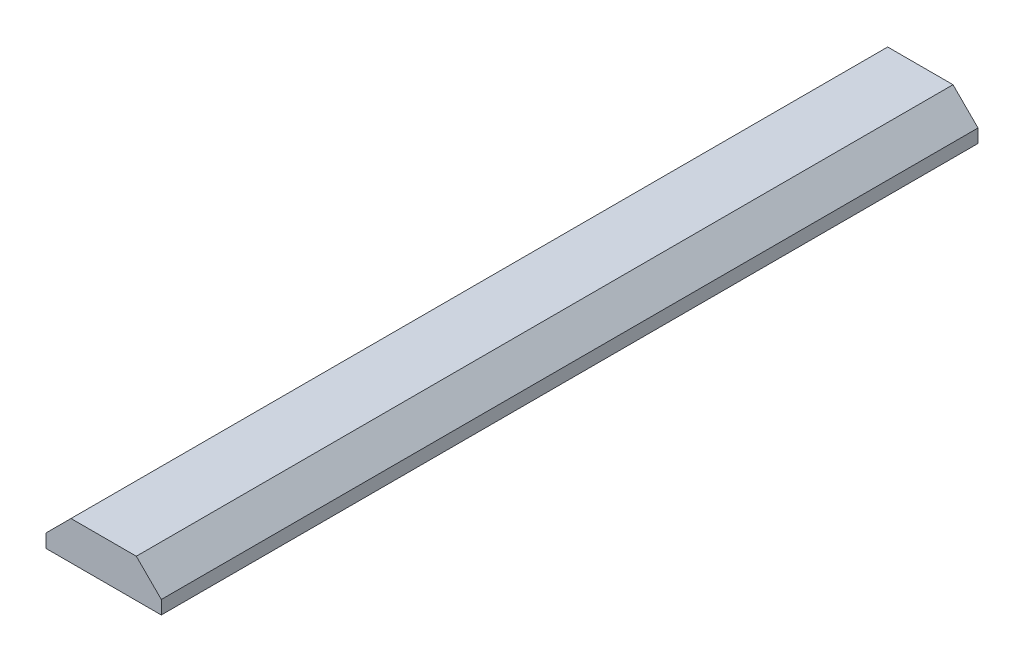
ISO-10303-21;
HEADER;
FILE_DESCRIPTION(('STEP AP214'),'2;1');
FILE_NAME('part.step','',(''),(''),'','','');
FILE_SCHEMA(('AUTOMOTIVE_DESIGN { 1 0 10303 214 1 1 1 1 }'));
ENDSEC;
DATA;
#1=APPLICATION_CONTEXT('core data for automotive mechanical design processes');
#2=APPLICATION_PROTOCOL_DEFINITION('international standard','automotive_design',2000,#1);
#3=PRODUCT_CONTEXT('',#1,'mechanical');
#4=PRODUCT('Part','Part','',(#3));
#5=PRODUCT_RELATED_PRODUCT_CATEGORY('part','',(#4));
#6=PRODUCT_DEFINITION_FORMATION('','',#4);
#7=PRODUCT_DEFINITION_CONTEXT('part definition',#1,'design');
#8=PRODUCT_DEFINITION('design','',#6,#7);
#9=PRODUCT_DEFINITION_SHAPE('','',#8);
#10=(LENGTH_UNIT() NAMED_UNIT(*) SI_UNIT(.MILLI.,.METRE.));
#11=(NAMED_UNIT(*) PLANE_ANGLE_UNIT() SI_UNIT($,.RADIAN.));
#12=(NAMED_UNIT(*) SI_UNIT($,.STERADIAN.) SOLID_ANGLE_UNIT());
#13=UNCERTAINTY_MEASURE_WITH_UNIT(LENGTH_MEASURE(1.E-05),#10,'distance_accuracy_value','');
#14=(GEOMETRIC_REPRESENTATION_CONTEXT(3) GLOBAL_UNCERTAINTY_ASSIGNED_CONTEXT((#13)) GLOBAL_UNIT_ASSIGNED_CONTEXT((#10,
#11,#12)) REPRESENTATION_CONTEXT('',''));
#15=CARTESIAN_POINT('',(0.,0.,0.));
#16=DIRECTION('',(0.,0.,1.));
#17=DIRECTION('',(1.,0.,0.));
#18=AXIS2_PLACEMENT_3D('',#15,#16,#17);
#19=CARTESIAN_POINT('',(3.4,1.80885878693797,85.));
#20=DIRECTION('',(0.707106781186549,0.707106781186546,0.));
#21=DIRECTION('',(-0.707106781186546,0.707106781186549,0.));
#22=AXIS2_PLACEMENT_3D('',#19,#20,#21);
#23=PLANE('',#22);
#24=DIRECTION('',(0.707106781186546,-0.707106781186549,0.));
#25=VECTOR('',#24,1.);
#26=CARTESIAN_POINT('',(3.4,1.80885878693797,0.));
#27=LINE('',#26,#25);
#28=CARTESIAN_POINT('',(3.4,1.80885878693797,0.));
#29=VERTEX_POINT('',#28);
#30=CARTESIAN_POINT('',(6.,-0.791141213062042,0.));
#31=VERTEX_POINT('',#30);
#32=EDGE_CURVE('E127',#29,#31,#27,.T.);
#33=ORIENTED_EDGE('',*,*,#32,.F.);
#34=DIRECTION('',(0.,0.,-1.));
#35=VECTOR('',#34,1.);
#36=CARTESIAN_POINT('',(3.4,1.80885878693797,85.));
#37=LINE('',#36,#35);
#38=CARTESIAN_POINT('',(3.4,1.80885878693797,85.));
#39=VERTEX_POINT('',#38);
#40=EDGE_CURVE('E11',#39,#29,#37,.T.);
#41=ORIENTED_EDGE('',*,*,#40,.F.);
#42=DIRECTION('',(0.707106781186546,-0.707106781186549,0.));
#43=VECTOR('',#42,1.);
#44=CARTESIAN_POINT('',(3.4,1.80885878693797,85.));
#45=LINE('',#44,#43);
#46=CARTESIAN_POINT('',(6.,-0.791141213062042,85.));
#47=VERTEX_POINT('',#46);
#48=EDGE_CURVE('E139',#39,#47,#45,.T.);
#49=ORIENTED_EDGE('',*,*,#48,.T.);
#50=DIRECTION('',(0.,0.,-1.));
#51=VECTOR('',#50,1.);
#52=CARTESIAN_POINT('',(6.,-0.791141213062042,85.));
#53=LINE('',#52,#51);
#54=EDGE_CURVE('E44',#47,#31,#53,.T.);
#55=ORIENTED_EDGE('',*,*,#54,.T.);
#56=EDGE_LOOP('',(#33,#41,#49,#55));
#57=FACE_BOUND('',#56,.T.);
#58=ADVANCED_FACE('F41',(#57),#23,.T.);
#59=CARTESIAN_POINT('',(3.4,1.80885878693797,85.));
#60=DIRECTION('',(0.,-1.,0.));
#61=DIRECTION('',(0.,0.,-1.));
#62=AXIS2_PLACEMENT_3D('',#59,#60,#61);
#63=PLANE('',#62);
#64=DIRECTION('',(-1.,0.,0.));
#65=VECTOR('',#64,1.);
#66=CARTESIAN_POINT('',(3.4,1.80885878693797,0.));
#67=LINE('',#66,#65);
#68=CARTESIAN_POINT('',(-3.4,1.80885878693797,0.));
#69=VERTEX_POINT('',#68);
#70=EDGE_CURVE('E80',#29,#69,#67,.T.);
#71=ORIENTED_EDGE('',*,*,#70,.T.);
#72=DIRECTION('',(0.,0.,-1.));
#73=VECTOR('',#72,1.);
#74=CARTESIAN_POINT('',(-3.4,1.80885878693797,85.));
#75=LINE('',#74,#73);
#76=CARTESIAN_POINT('',(-3.4,1.80885878693797,85.));
#77=VERTEX_POINT('',#76);
#78=EDGE_CURVE('E50',#77,#69,#75,.T.);
#79=ORIENTED_EDGE('',*,*,#78,.F.);
#80=DIRECTION('',(-1.,0.,0.));
#81=VECTOR('',#80,1.);
#82=CARTESIAN_POINT('',(3.4,1.80885878693797,85.));
#83=LINE('',#82,#81);
#84=EDGE_CURVE('E105',#39,#77,#83,.T.);
#85=ORIENTED_EDGE('',*,*,#84,.F.);
#86=ORIENTED_EDGE('',*,*,#40,.T.);
#87=EDGE_LOOP('',(#71,#79,#85,#86));
#88=FACE_BOUND('',#87,.T.);
#89=ADVANCED_FACE('F159',(#88),#63,.F.);
#90=CARTESIAN_POINT('',(-3.4,1.80885878693797,85.));
#91=DIRECTION('',(0.707106781186549,-0.707106781186546,0.));
#92=DIRECTION('',(0.707106781186546,0.707106781186549,0.));
#93=AXIS2_PLACEMENT_3D('',#90,#91,#92);
#94=PLANE('',#93);
#95=DIRECTION('',(-0.707106781186546,-0.707106781186549,0.));
#96=VECTOR('',#95,1.);
#97=CARTESIAN_POINT('',(-3.4,1.80885878693797,0.));
#98=LINE('',#97,#96);
#99=CARTESIAN_POINT('',(-6.,-0.791141213062042,0.));
#100=VERTEX_POINT('',#99);
#101=EDGE_CURVE('E112',#69,#100,#98,.T.);
#102=ORIENTED_EDGE('',*,*,#101,.T.);
#103=DIRECTION('',(0.,0.,-1.));
#104=VECTOR('',#103,1.);
#105=CARTESIAN_POINT('',(-6.,-0.791141213062042,85.));
#106=LINE('',#105,#104);
#107=CARTESIAN_POINT('',(-6.,-0.791141213062042,85.));
#108=VERTEX_POINT('',#107);
#109=EDGE_CURVE('E109',#108,#100,#106,.T.);
#110=ORIENTED_EDGE('',*,*,#109,.F.);
#111=DIRECTION('',(-0.707106781186546,-0.707106781186549,0.));
#112=VECTOR('',#111,1.);
#113=CARTESIAN_POINT('',(-3.4,1.80885878693797,85.));
#114=LINE('',#113,#112);
#115=EDGE_CURVE('E98',#77,#108,#114,.T.);
#116=ORIENTED_EDGE('',*,*,#115,.F.);
#117=ORIENTED_EDGE('',*,*,#78,.T.);
#118=EDGE_LOOP('',(#102,#110,#116,#117));
#119=FACE_BOUND('',#118,.T.);
#120=ADVANCED_FACE('F110',(#119),#94,.F.);
#121=CARTESIAN_POINT('',(-6.,-0.791141213062042,85.));
#122=DIRECTION('',(1.,0.,0.));
#123=DIRECTION('',(0.,0.,-1.));
#124=AXIS2_PLACEMENT_3D('',#121,#122,#123);
#125=PLANE('',#124);
#126=DIRECTION('',(0.,-1.,0.));
#127=VECTOR('',#126,1.);
#128=CARTESIAN_POINT('',(-6.,-0.791141213062042,0.));
#129=LINE('',#128,#127);
#130=CARTESIAN_POINT('',(-6.,-2.19114121306203,0.));
#131=VERTEX_POINT('',#130);
#132=EDGE_CURVE('E136',#100,#131,#129,.T.);
#133=ORIENTED_EDGE('',*,*,#132,.T.);
#134=DIRECTION('',(0.,0.,-1.));
#135=VECTOR('',#134,1.);
#136=CARTESIAN_POINT('',(-6.,-2.19114121306203,85.));
#137=LINE('',#136,#135);
#138=CARTESIAN_POINT('',(-6.,-2.19114121306203,85.));
#139=VERTEX_POINT('',#138);
#140=EDGE_CURVE('E115',#139,#131,#137,.T.);
#141=ORIENTED_EDGE('',*,*,#140,.F.);
#142=DIRECTION('',(0.,-1.,0.));
#143=VECTOR('',#142,1.);
#144=CARTESIAN_POINT('',(-6.,-0.791141213062042,85.));
#145=LINE('',#144,#143);
#146=EDGE_CURVE('E103',#108,#139,#145,.T.);
#147=ORIENTED_EDGE('',*,*,#146,.F.);
#148=ORIENTED_EDGE('',*,*,#109,.T.);
#149=EDGE_LOOP('',(#133,#141,#147,#148));
#150=FACE_BOUND('',#149,.T.);
#151=ADVANCED_FACE('F117',(#150),#125,.F.);
#152=CARTESIAN_POINT('',(-6.,-2.19114121306203,85.));
#153=DIRECTION('',(0.,1.,0.));
#154=DIRECTION('',(0.,0.,1.));
#155=AXIS2_PLACEMENT_3D('',#152,#153,#154);
#156=PLANE('',#155);
#157=DIRECTION('',(1.,0.,0.));
#158=VECTOR('',#157,1.);
#159=CARTESIAN_POINT('',(-6.,-2.19114121306203,0.));
#160=LINE('',#159,#158);
#161=CARTESIAN_POINT('',(6.,-2.19114121306203,0.));
#162=VERTEX_POINT('',#161);
#163=EDGE_CURVE('E133',#131,#162,#160,.T.);
#164=ORIENTED_EDGE('',*,*,#163,.T.);
#165=DIRECTION('',(0.,0.,-1.));
#166=VECTOR('',#165,1.);
#167=CARTESIAN_POINT('',(6.,-2.19114121306203,85.));
#168=LINE('',#167,#166);
#169=CARTESIAN_POINT('',(6.,-2.19114121306203,85.));
#170=VERTEX_POINT('',#169);
#171=EDGE_CURVE('E142',#170,#162,#168,.T.);
#172=ORIENTED_EDGE('',*,*,#171,.F.);
#173=DIRECTION('',(1.,0.,0.));
#174=VECTOR('',#173,1.);
#175=CARTESIAN_POINT('',(-6.,-2.19114121306203,85.));
#176=LINE('',#175,#174);
#177=EDGE_CURVE('E120',#139,#170,#176,.T.);
#178=ORIENTED_EDGE('',*,*,#177,.F.);
#179=ORIENTED_EDGE('',*,*,#140,.T.);
#180=EDGE_LOOP('',(#164,#172,#178,#179));
#181=FACE_BOUND('',#180,.T.);
#182=ADVANCED_FACE('F149',(#181),#156,.F.);
#183=CARTESIAN_POINT('',(6.,-0.791141213062042,85.));
#184=DIRECTION('',(1.,0.,0.));
#185=DIRECTION('',(0.,0.,-1.));
#186=AXIS2_PLACEMENT_3D('',#183,#184,#185);
#187=PLANE('',#186);
#188=DIRECTION('',(0.,-1.,0.));
#189=VECTOR('',#188,1.);
#190=CARTESIAN_POINT('',(6.,-0.791141213062042,0.));
#191=LINE('',#190,#189);
#192=EDGE_CURVE('E130',#31,#162,#191,.T.);
#193=ORIENTED_EDGE('',*,*,#192,.F.);
#194=ORIENTED_EDGE('',*,*,#54,.F.);
#195=DIRECTION('',(0.,-1.,0.));
#196=VECTOR('',#195,1.);
#197=CARTESIAN_POINT('',(6.,-0.791141213062042,85.));
#198=LINE('',#197,#196);
#199=EDGE_CURVE('E122',#47,#170,#198,.T.);
#200=ORIENTED_EDGE('',*,*,#199,.T.);
#201=ORIENTED_EDGE('',*,*,#171,.T.);
#202=EDGE_LOOP('',(#193,#194,#200,#201));
#203=FACE_BOUND('',#202,.T.);
#204=ADVANCED_FACE('F144',(#203),#187,.T.);
#205=CARTESIAN_POINT('',(0.,0.,85.));
#206=DIRECTION('',(0.,0.,-1.));
#207=DIRECTION('',(-1.,0.,0.));
#208=AXIS2_PLACEMENT_3D('',#205,#206,#207);
#209=PLANE('',#208);
#210=ORIENTED_EDGE('',*,*,#48,.F.);
#211=ORIENTED_EDGE('',*,*,#84,.T.);
#212=ORIENTED_EDGE('',*,*,#115,.T.);
#213=ORIENTED_EDGE('',*,*,#146,.T.);
#214=ORIENTED_EDGE('',*,*,#177,.T.);
#215=ORIENTED_EDGE('',*,*,#199,.F.);
#216=EDGE_LOOP('',(#210,#211,#212,#213,#214,#215));
#217=FACE_BOUND('',#216,.T.);
#218=ADVANCED_FACE('F101',(#217),#209,.F.);
#219=CARTESIAN_POINT('',(0.,0.,0.));
#220=DIRECTION('',(0.,0.,-1.));
#221=DIRECTION('',(-1.,0.,0.));
#222=AXIS2_PLACEMENT_3D('',#219,#220,#221);
#223=PLANE('',#222);
#224=ORIENTED_EDGE('',*,*,#32,.T.);
#225=ORIENTED_EDGE('',*,*,#192,.T.);
#226=ORIENTED_EDGE('',*,*,#163,.F.);
#227=ORIENTED_EDGE('',*,*,#132,.F.);
#228=ORIENTED_EDGE('',*,*,#101,.F.);
#229=ORIENTED_EDGE('',*,*,#70,.F.);
#230=EDGE_LOOP('',(#224,#225,#226,#227,#228,#229));
#231=FACE_BOUND('',#230,.T.);
#232=ADVANCED_FACE('F147',(#231),#223,.T.);
#233=CLOSED_SHELL('',(#58,#89,#120,#151,#182,#204,#218,#232));
#234=MANIFOLD_SOLID_BREP('B2',#233);
#235=ADVANCED_BREP_SHAPE_REPRESENTATION('',(#18,#234),#14);
#236=SHAPE_DEFINITION_REPRESENTATION(#9,#235);
ENDSEC;
END-ISO-10303-21;
